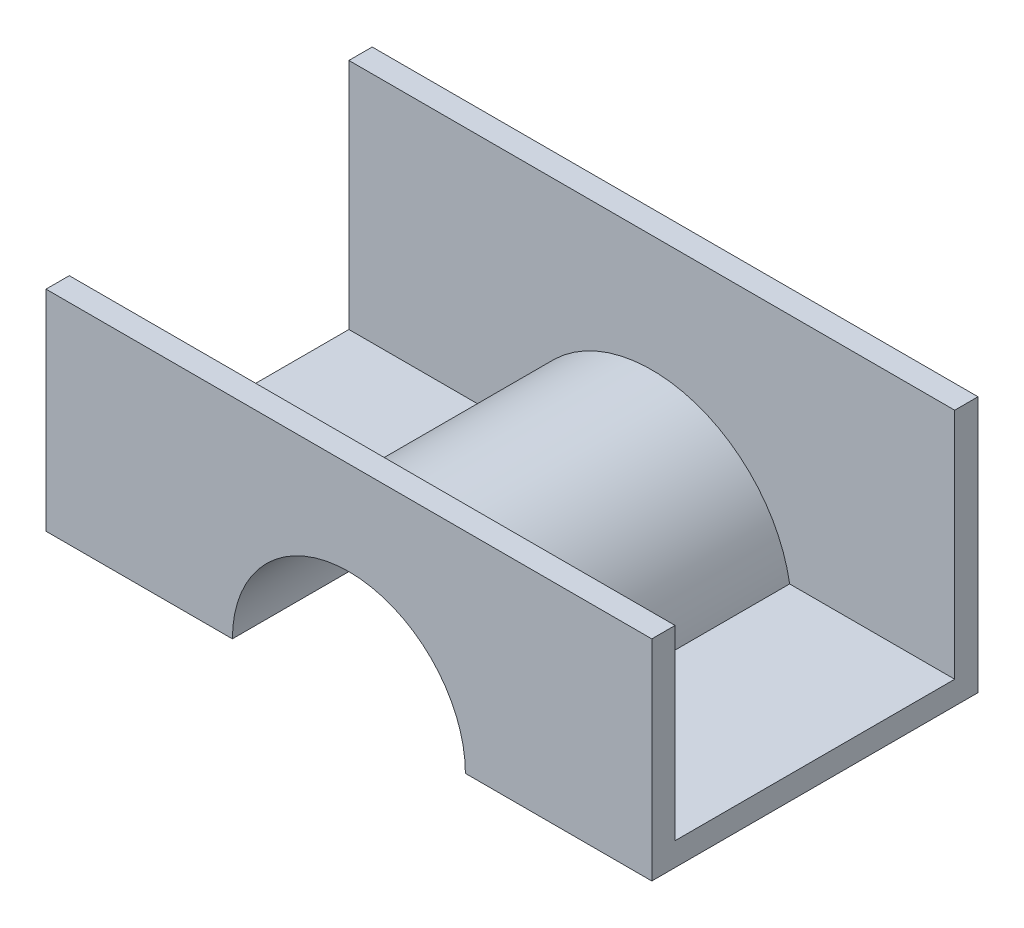
ISO-10303-21;
HEADER;
FILE_DESCRIPTION(('STEP AP214'),'2;1');
FILE_NAME('part.step','',(''),(''),'','','');
FILE_SCHEMA(('AUTOMOTIVE_DESIGN { 1 0 10303 214 1 1 1 1 }'));
ENDSEC;
DATA;
#1=APPLICATION_CONTEXT('core data for automotive mechanical design processes');
#2=APPLICATION_PROTOCOL_DEFINITION('international standard','automotive_design',2000,#1);
#3=PRODUCT_CONTEXT('',#1,'mechanical');
#4=PRODUCT('Part','Part','',(#3));
#5=PRODUCT_RELATED_PRODUCT_CATEGORY('part','',(#4));
#6=PRODUCT_DEFINITION_FORMATION('','',#4);
#7=PRODUCT_DEFINITION_CONTEXT('part definition',#1,'design');
#8=PRODUCT_DEFINITION('design','',#6,#7);
#9=PRODUCT_DEFINITION_SHAPE('','',#8);
#10=(LENGTH_UNIT() NAMED_UNIT(*) SI_UNIT(.MILLI.,.METRE.));
#11=(NAMED_UNIT(*) PLANE_ANGLE_UNIT() SI_UNIT($,.RADIAN.));
#12=(NAMED_UNIT(*) SI_UNIT($,.STERADIAN.) SOLID_ANGLE_UNIT());
#13=UNCERTAINTY_MEASURE_WITH_UNIT(LENGTH_MEASURE(1.E-05),#10,'distance_accuracy_value','');
#14=(GEOMETRIC_REPRESENTATION_CONTEXT(3) GLOBAL_UNCERTAINTY_ASSIGNED_CONTEXT((#13)) GLOBAL_UNIT_ASSIGNED_CONTEXT((#10,
#11,#12)) REPRESENTATION_CONTEXT('',''));
#15=CARTESIAN_POINT('',(0.,0.,0.));
#16=DIRECTION('',(0.,0.,1.));
#17=DIRECTION('',(1.,0.,0.));
#18=AXIS2_PLACEMENT_3D('',#15,#16,#17);
#19=CARTESIAN_POINT('',(-0.00667937524967909,-1.70902601954589,0.0059580262507078));
#20=DIRECTION('',(0.,0.,1.));
#21=DIRECTION('',(1.,0.,0.));
#22=AXIS2_PLACEMENT_3D('',#19,#20,#21);
#23=PLANE('',#22);
#24=DIRECTION('',(1.,0.,0.));
#25=VECTOR('',#24,1.);
#26=CARTESIAN_POINT('',(-0.00667937524967909,-1.80305198756978,0.0059580262507078));
#27=LINE('',#26,#25);
#28=CARTESIAN_POINT('',(-0.412929375249647,-1.80305198756978,0.0059580262507078));
#29=VERTEX_POINT('',#28);
#30=CARTESIAN_POINT('',(-0.16292937524967,-1.80305198756976,0.00595802625068876));
#31=VERTEX_POINT('',#30);
#32=EDGE_CURVE('E11',#29,#31,#27,.T.);
#33=ORIENTED_EDGE('',*,*,#32,.F.);
#34=DIRECTION('',(0.,-1.,0.));
#35=VECTOR('',#34,1.);
#36=CARTESIAN_POINT('',(-0.412929375249643,-1.70902601954589,0.0059580262507078));
#37=LINE('',#36,#35);
#38=CARTESIAN_POINT('',(-0.412929375249658,-1.45930198756974,0.0059580262507078));
#39=VERTEX_POINT('',#38);
#40=EDGE_CURVE('E24',#39,#29,#37,.T.);
#41=ORIENTED_EDGE('',*,*,#40,.F.);
#42=DIRECTION('',(-1.,0.,0.));
#43=VECTOR('',#42,1.);
#44=CARTESIAN_POINT('',(-0.00667937524967909,-1.4593019875697,0.0059580262507078));
#45=LINE('',#44,#43);
#46=CARTESIAN_POINT('',(0.399570624750305,-1.45930198756971,0.0059580262507078));
#47=VERTEX_POINT('',#46);
#48=EDGE_CURVE('E195',#47,#39,#45,.T.);
#49=ORIENTED_EDGE('',*,*,#48,.F.);
#50=DIRECTION('',(0.,1.,0.));
#51=VECTOR('',#50,1.);
#52=CARTESIAN_POINT('',(0.399570624750316,-1.70902601954589,0.0059580262507078));
#53=LINE('',#52,#51);
#54=CARTESIAN_POINT('',(0.399570624750316,-1.80305198756971,0.0059580262507078));
#55=VERTEX_POINT('',#54);
#56=EDGE_CURVE('E192',#55,#47,#53,.T.);
#57=ORIENTED_EDGE('',*,*,#56,.F.);
#58=DIRECTION('',(1.,0.,0.));
#59=VECTOR('',#58,1.);
#60=CARTESIAN_POINT('',(-0.00667937524967909,-1.80305198756972,0.0059580262507078));
#61=LINE('',#60,#59);
#62=CARTESIAN_POINT('',(0.14957062475033,-1.80305198756975,0.00595802625070778));
#63=VERTEX_POINT('',#62);
#64=EDGE_CURVE('E189',#63,#55,#61,.T.);
#65=ORIENTED_EDGE('',*,*,#64,.F.);
#66=CARTESIAN_POINT('',(-0.0066793752496696,-1.80305198756977,0.00595802625069509));
#67=DIRECTION('',(1.62409768173737E-13,0.,-1.));
#68=DIRECTION('',(1.,-1.65145674912992E-13,1.62409768173737E-13));
#69=AXIS2_PLACEMENT_3D('',#66,#67,#68);
#70=CIRCLE('',#69,0.15625);
#71=EDGE_CURVE('E186',#31,#63,#70,.T.);
#72=ORIENTED_EDGE('',*,*,#71,.F.);
#73=EDGE_LOOP('',(#33,#41,#49,#57,#65,#72));
#74=FACE_BOUND('',#73,.T.);
#75=ADVANCED_FACE('F17',(#74),#23,.F.);
#76=CARTESIAN_POINT('',(-0.0066793752496696,-1.80305198756977,0.00595802625073314));
#77=DIRECTION('',(-1.62409768173737E-13,0.,1.));
#78=DIRECTION('',(1.,0.,1.62409768173737E-13));
#79=AXIS2_PLACEMENT_3D('',#76,#77,#78);
#80=CYLINDRICAL_SURFACE('',#79,0.15625);
#81=DIRECTION('',(1.62409768173737E-13,0.,-1.));
#82=VECTOR('',#81,1.);
#83=CARTESIAN_POINT('',(0.14957062475033,-1.80305198756977,0.00595802625075852));
#84=LINE('',#83,#82);
#85=CARTESIAN_POINT('',(0.149570624750259,-1.80305198756975,0.443458026250721));
#86=VERTEX_POINT('',#85);
#87=EDGE_CURVE('E183',#86,#63,#84,.T.);
#88=ORIENTED_EDGE('',*,*,#87,.F.);
#89=CARTESIAN_POINT('',(-0.00667937524974066,-1.80305198756977,0.443458026250708));
#90=DIRECTION('',(1.62409768173737E-13,0.,-1.));
#91=DIRECTION('',(1.,-1.63757896132211E-13,1.62409768173737E-13));
#92=AXIS2_PLACEMENT_3D('',#89,#90,#91);
#93=CIRCLE('',#92,0.15625);
#94=CARTESIAN_POINT('',(-0.162929375249741,-1.80305198756975,0.443458026250695));
#95=VERTEX_POINT('',#94);
#96=EDGE_CURVE('E181',#95,#86,#93,.T.);
#97=ORIENTED_EDGE('',*,*,#96,.F.);
#98=DIRECTION('',(-1.62409768173737E-13,0.,1.));
#99=VECTOR('',#98,1.);
#100=CARTESIAN_POINT('',(-0.16292937524967,-1.80305198756975,0.00595802625070776));
#101=LINE('',#100,#99);
#102=EDGE_CURVE('E179',#31,#95,#101,.T.);
#103=ORIENTED_EDGE('',*,*,#102,.F.);
#104=ORIENTED_EDGE('',*,*,#71,.T.);
#105=EDGE_LOOP('',(#88,#97,#103,#104));
#106=FACE_BOUND('',#105,.T.);
#107=ADVANCED_FACE('F235',(#106),#80,.F.);
#108=CARTESIAN_POINT('',(-0.16292937524967,-1.80305198756975,0.0059580262507078));
#109=DIRECTION('',(1.01196828694583E-13,-1.,0.));
#110=DIRECTION('',(1.,1.01196828694583E-13,0.));
#111=AXIS2_PLACEMENT_3D('',#108,#109,#110);
#112=PLANE('',#111);
#113=DIRECTION('',(-1.,-1.01196828694583E-13,0.));
#114=VECTOR('',#113,1.);
#115=CARTESIAN_POINT('',(-0.16292937524967,-1.80305198756975,0.443458026250682));
#116=LINE('',#115,#114);
#117=CARTESIAN_POINT('',(-0.412929375249656,-1.80305198756978,0.443458026250691));
#118=VERTEX_POINT('',#117);
#119=EDGE_CURVE('E177',#95,#118,#116,.T.);
#120=ORIENTED_EDGE('',*,*,#119,.T.);
#121=DIRECTION('',(0.,0.,-1.));
#122=VECTOR('',#121,1.);
#123=CARTESIAN_POINT('',(-0.412929375249656,-1.80305198756978,0.0059580262507078));
#124=LINE('',#123,#122);
#125=EDGE_CURVE('E175',#118,#29,#124,.T.);
#126=ORIENTED_EDGE('',*,*,#125,.T.);
#127=ORIENTED_EDGE('',*,*,#32,.T.);
#128=ORIENTED_EDGE('',*,*,#102,.T.);
#129=EDGE_LOOP('',(#120,#126,#127,#128));
#130=FACE_BOUND('',#129,.T.);
#131=ADVANCED_FACE('F201',(#130),#112,.T.);
#132=CARTESIAN_POINT('',(-0.41292937524969,-1.45930198756977,0.412208026250708));
#133=DIRECTION('',(-1.,-1.01196828694583E-13,0.));
#134=DIRECTION('',(1.01196828694583E-13,-1.,0.));
#135=AXIS2_PLACEMENT_3D('',#132,#133,#134);
#136=PLANE('',#135);
#137=DIRECTION('',(0.,0.,-1.));
#138=VECTOR('',#137,1.);
#139=CARTESIAN_POINT('',(-0.41292937524969,-1.45930198756981,0.412208026250708));
#140=LINE('',#139,#138);
#141=CARTESIAN_POINT('',(-0.41292937524969,-1.45930198756981,0.0372080262507079));
#142=VERTEX_POINT('',#141);
#143=EDGE_CURVE('E172',#142,#39,#140,.T.);
#144=ORIENTED_EDGE('',*,*,#143,.T.);
#145=ORIENTED_EDGE('',*,*,#40,.T.);
#146=ORIENTED_EDGE('',*,*,#125,.F.);
#147=DIRECTION('',(-1.01196828694583E-13,1.,0.));
#148=VECTOR('',#147,1.);
#149=CARTESIAN_POINT('',(-0.41292937524969,-1.45930198756977,0.443458026250708));
#150=LINE('',#149,#148);
#151=CARTESIAN_POINT('',(-0.412929375249684,-1.52180198756976,0.443458026250708));
#152=VERTEX_POINT('',#151);
#153=EDGE_CURVE('E170',#118,#152,#150,.T.);
#154=ORIENTED_EDGE('',*,*,#153,.T.);
#155=DIRECTION('',(0.,0.,-1.));
#156=VECTOR('',#155,1.);
#157=CARTESIAN_POINT('',(-0.412929375249684,-1.52180198756979,0.412208026250708));
#158=LINE('',#157,#156);
#159=CARTESIAN_POINT('',(-0.412929375249684,-1.52180198756979,0.412208026250708));
#160=VERTEX_POINT('',#159);
#161=EDGE_CURVE('E168',#152,#160,#158,.T.);
#162=ORIENTED_EDGE('',*,*,#161,.T.);
#163=DIRECTION('',(1.01196828694583E-13,-1.,0.));
#164=VECTOR('',#163,1.);
#165=CARTESIAN_POINT('',(-0.41292937524969,-1.45930198756977,0.412208026250708));
#166=LINE('',#165,#164);
#167=CARTESIAN_POINT('',(-0.412929375249659,-1.77180198756977,0.412208026250708));
#168=VERTEX_POINT('',#167);
#169=EDGE_CURVE('E166',#160,#168,#166,.T.);
#170=ORIENTED_EDGE('',*,*,#169,.T.);
#171=DIRECTION('',(0.,0.,-1.));
#172=VECTOR('',#171,1.);
#173=CARTESIAN_POINT('',(-0.412929375249659,-1.77180198756977,0.412208026250708));
#174=LINE('',#173,#172);
#175=CARTESIAN_POINT('',(-0.412929375249669,-1.77180198756977,0.0372080262507079));
#176=VERTEX_POINT('',#175);
#177=EDGE_CURVE('E164',#168,#176,#174,.T.);
#178=ORIENTED_EDGE('',*,*,#177,.T.);
#179=DIRECTION('',(-1.01196828694583E-13,1.,0.));
#180=VECTOR('',#179,1.);
#181=CARTESIAN_POINT('',(-0.41292937524969,-1.45930198756977,0.0372080262507079));
#182=LINE('',#181,#180);
#183=EDGE_CURVE('E161',#176,#142,#182,.T.);
#184=ORIENTED_EDGE('',*,*,#183,.T.);
#185=EDGE_LOOP('',(#144,#145,#146,#154,#162,#170,#178,#184));
#186=FACE_BOUND('',#185,.T.);
#187=ADVANCED_FACE('F199',(#186),#136,.T.);
#188=CARTESIAN_POINT('',(-0.412929375249619,-1.45930198756981,0.00595802625070787));
#189=DIRECTION('',(-1.01196828694583E-13,1.,0.));
#190=DIRECTION('',(-1.,-1.01196828694583E-13,0.));
#191=AXIS2_PLACEMENT_3D('',#188,#189,#190);
#192=PLANE('',#191);
#193=DIRECTION('',(1.,1.01196828694583E-13,0.));
#194=VECTOR('',#193,1.);
#195=CARTESIAN_POINT('',(-0.412929375249619,-1.45930198756981,0.037208026250708));
#196=LINE('',#195,#194);
#197=CARTESIAN_POINT('',(0.399570624750281,-1.45930198756973,0.037208026250708));
#198=VERTEX_POINT('',#197);
#199=EDGE_CURVE('E159',#142,#198,#196,.T.);
#200=ORIENTED_EDGE('',*,*,#199,.T.);
#201=DIRECTION('',(0.,0.,-1.));
#202=VECTOR('',#201,1.);
#203=CARTESIAN_POINT('',(0.399570624750281,-1.45930198756973,0.00595802625070787));
#204=LINE('',#203,#202);
#205=EDGE_CURVE('E156',#198,#47,#204,.T.);
#206=ORIENTED_EDGE('',*,*,#205,.T.);
#207=ORIENTED_EDGE('',*,*,#48,.T.);
#208=ORIENTED_EDGE('',*,*,#143,.F.);
#209=EDGE_LOOP('',(#200,#206,#207,#208));
#210=FACE_BOUND('',#209,.T.);
#211=ADVANCED_FACE('F228',(#210),#192,.T.);
#212=CARTESIAN_POINT('',(0.399570624750281,-1.45930198756969,0.443458026250708));
#213=DIRECTION('',(1.,1.01196828694583E-13,0.));
#214=DIRECTION('',(-1.01196828694583E-13,1.,0.));
#215=AXIS2_PLACEMENT_3D('',#212,#213,#214);
#216=PLANE('',#215);
#217=ORIENTED_EDGE('',*,*,#205,.F.);
#218=DIRECTION('',(1.01196828694583E-13,-1.,0.));
#219=VECTOR('',#218,1.);
#220=CARTESIAN_POINT('',(0.399570624750281,-1.45930198756969,0.0372080262507079));
#221=LINE('',#220,#219);
#222=CARTESIAN_POINT('',(0.399570624750313,-1.7718019875697,0.0372080262507079));
#223=VERTEX_POINT('',#222);
#224=EDGE_CURVE('E154',#198,#223,#221,.T.);
#225=ORIENTED_EDGE('',*,*,#224,.T.);
#226=DIRECTION('',(0.,0.,1.));
#227=VECTOR('',#226,1.);
#228=CARTESIAN_POINT('',(0.399570624750313,-1.77180198756969,0.443458026250708));
#229=LINE('',#228,#227);
#230=CARTESIAN_POINT('',(0.399570624750305,-1.77180198756969,0.412208026250708));
#231=VERTEX_POINT('',#230);
#232=EDGE_CURVE('E152',#223,#231,#229,.T.);
#233=ORIENTED_EDGE('',*,*,#232,.T.);
#234=DIRECTION('',(-1.01196828694583E-13,1.,0.));
#235=VECTOR('',#234,1.);
#236=CARTESIAN_POINT('',(0.399570624750281,-1.45930198756969,0.412208026250708));
#237=LINE('',#236,#235);
#238=CARTESIAN_POINT('',(0.399570624750288,-1.52180198756973,0.412208026250708));
#239=VERTEX_POINT('',#238);
#240=EDGE_CURVE('E108',#231,#239,#237,.T.);
#241=ORIENTED_EDGE('',*,*,#240,.T.);
#242=DIRECTION('',(0.,0.,1.));
#243=VECTOR('',#242,1.);
#244=CARTESIAN_POINT('',(0.399570624750288,-1.52180198756971,0.443458026250708));
#245=LINE('',#244,#243);
#246=CARTESIAN_POINT('',(0.399570624750297,-1.52180198756971,0.443458026250708));
#247=VERTEX_POINT('',#246);
#248=EDGE_CURVE('E149',#239,#247,#245,.T.);
#249=ORIENTED_EDGE('',*,*,#248,.T.);
#250=DIRECTION('',(1.01196828694583E-13,-1.,0.));
#251=VECTOR('',#250,1.);
#252=CARTESIAN_POINT('',(0.399570624750281,-1.45930198756969,0.443458026250708));
#253=LINE('',#252,#251);
#254=CARTESIAN_POINT('',(0.399570624750316,-1.8030519875697,0.443458026250708));
#255=VERTEX_POINT('',#254);
#256=EDGE_CURVE('E147',#247,#255,#253,.T.);
#257=ORIENTED_EDGE('',*,*,#256,.T.);
#258=DIRECTION('',(0.,0.,-1.));
#259=VECTOR('',#258,1.);
#260=CARTESIAN_POINT('',(0.399570624750316,-1.8030519875697,0.443458026250708));
#261=LINE('',#260,#259);
#262=EDGE_CURVE('E144',#255,#55,#261,.T.);
#263=ORIENTED_EDGE('',*,*,#262,.T.);
#264=ORIENTED_EDGE('',*,*,#56,.T.);
#265=EDGE_LOOP('',(#217,#225,#233,#241,#249,#257,#263,#264));
#266=FACE_BOUND('',#265,.T.);
#267=ADVANCED_FACE('F230',(#266),#216,.T.);
#268=CARTESIAN_POINT('',(0.180820624750302,-1.80305198756972,0.0059580262507078));
#269=DIRECTION('',(1.01196828694583E-13,-1.,0.));
#270=DIRECTION('',(1.,1.01196828694583E-13,0.));
#271=AXIS2_PLACEMENT_3D('',#268,#269,#270);
#272=PLANE('',#271);
#273=DIRECTION('',(-1.,-1.01196828694583E-13,0.));
#274=VECTOR('',#273,1.);
#275=CARTESIAN_POINT('',(0.180820624750302,-1.80305198756972,0.443458026250708));
#276=LINE('',#275,#274);
#277=EDGE_CURVE('E141',#255,#86,#276,.T.);
#278=ORIENTED_EDGE('',*,*,#277,.T.);
#279=ORIENTED_EDGE('',*,*,#87,.T.);
#280=ORIENTED_EDGE('',*,*,#64,.T.);
#281=ORIENTED_EDGE('',*,*,#262,.F.);
#282=EDGE_LOOP('',(#278,#279,#280,#281));
#283=FACE_BOUND('',#282,.T.);
#284=ADVANCED_FACE('F233',(#283),#272,.T.);
#285=CARTESIAN_POINT('',(-0.41292937524969,-1.45930198756977,0.443458026250708));
#286=DIRECTION('',(0.,0.,1.));
#287=DIRECTION('',(1.,0.,0.));
#288=AXIS2_PLACEMENT_3D('',#285,#286,#287);
#289=PLANE('',#288);
#290=ORIENTED_EDGE('',*,*,#119,.F.);
#291=ORIENTED_EDGE('',*,*,#96,.T.);
#292=ORIENTED_EDGE('',*,*,#277,.F.);
#293=ORIENTED_EDGE('',*,*,#256,.F.);
#294=DIRECTION('',(-1.,0.,0.));
#295=VECTOR('',#294,1.);
#296=CARTESIAN_POINT('',(-0.41292937524969,-1.52180198756971,0.443458026250708));
#297=LINE('',#296,#295);
#298=EDGE_CURVE('E138',#247,#152,#297,.T.);
#299=ORIENTED_EDGE('',*,*,#298,.T.);
#300=ORIENTED_EDGE('',*,*,#153,.F.);
#301=EDGE_LOOP('',(#290,#291,#292,#293,#299,#300));
#302=FACE_BOUND('',#301,.T.);
#303=ADVANCED_FACE('F206',(#302),#289,.T.);
#304=CARTESIAN_POINT('',(-0.00667937524968858,-1.61555198756977,0.0372080262507079));
#305=DIRECTION('',(0.,0.,1.));
#306=DIRECTION('',(1.,0.,0.));
#307=AXIS2_PLACEMENT_3D('',#304,#305,#306);
#308=PLANE('',#307);
#309=ORIENTED_EDGE('',*,*,#224,.F.);
#310=ORIENTED_EDGE('',*,*,#199,.F.);
#311=ORIENTED_EDGE('',*,*,#183,.F.);
#312=DIRECTION('',(1.,0.,0.));
#313=VECTOR('',#312,1.);
#314=CARTESIAN_POINT('',(-0.00667937524968858,-1.77180198756977,0.0372080262507079));
#315=LINE('',#314,#313);
#316=CARTESIAN_POINT('',(-0.191556868471649,-1.77180198756976,0.0372080262506704));
#317=VERTEX_POINT('',#316);
#318=EDGE_CURVE('E136',#176,#317,#315,.T.);
#319=ORIENTED_EDGE('',*,*,#318,.T.);
#320=CARTESIAN_POINT('',(-0.00667937524974583,-1.8030519875697,0.0372080262506629));
#321=DIRECTION('',(1.62409768173737E-13,0.,-1.));
#322=DIRECTION('',(1.,0.,1.62409768173737E-13));
#323=AXIS2_PLACEMENT_3D('',#320,#321,#322);
#324=CIRCLE('',#323,0.187500000000043);
#325=CARTESIAN_POINT('',(0.178198117972179,-1.77180198756971,0.0372080262506854));
#326=VERTEX_POINT('',#325);
#327=EDGE_CURVE('E134',#317,#326,#324,.T.);
#328=ORIENTED_EDGE('',*,*,#327,.T.);
#329=DIRECTION('',(1.,0.,0.));
#330=VECTOR('',#329,1.);
#331=CARTESIAN_POINT('',(-0.00667937524968858,-1.77180198756971,0.0372080262507079));
#332=LINE('',#331,#330);
#333=EDGE_CURVE('E127',#326,#223,#332,.T.);
#334=ORIENTED_EDGE('',*,*,#333,.T.);
#335=EDGE_LOOP('',(#309,#310,#311,#319,#328,#334));
#336=FACE_BOUND('',#335,.T.);
#337=ADVANCED_FACE('F224',(#336),#308,.T.);
#338=CARTESIAN_POINT('',(0.399570624750313,-1.77180198756969,0.412208026250708));
#339=DIRECTION('',(-1.01196828694583E-13,1.,0.));
#340=DIRECTION('',(-1.,-1.01196828694583E-13,0.));
#341=AXIS2_PLACEMENT_3D('',#338,#339,#340);
#342=PLANE('',#341);
#343=DIRECTION('',(0.,0.,-1.));
#344=VECTOR('',#343,1.);
#345=CARTESIAN_POINT('',(-0.191556868471649,-1.77180198756975,0.412208026250708));
#346=LINE('',#345,#344);
#347=CARTESIAN_POINT('',(-0.191556868471685,-1.77180198756975,0.41220802625073));
#348=VERTEX_POINT('',#347);
#349=EDGE_CURVE('E120',#348,#317,#346,.T.);
#350=ORIENTED_EDGE('',*,*,#349,.T.);
#351=ORIENTED_EDGE('',*,*,#318,.F.);
#352=ORIENTED_EDGE('',*,*,#177,.F.);
#353=DIRECTION('',(1.,1.01196828694583E-13,0.));
#354=VECTOR('',#353,1.);
#355=CARTESIAN_POINT('',(0.399570624750313,-1.77180198756969,0.412208026250708));
#356=LINE('',#355,#354);
#357=EDGE_CURVE('E112',#168,#348,#356,.T.);
#358=ORIENTED_EDGE('',*,*,#357,.T.);
#359=EDGE_LOOP('',(#350,#351,#352,#358));
#360=FACE_BOUND('',#359,.T.);
#361=ADVANCED_FACE('F221',(#360),#342,.T.);
#362=CARTESIAN_POINT('',(0.399570624750281,-1.45930198756969,0.412208026250708));
#363=DIRECTION('',(0.,0.,-1.));
#364=DIRECTION('',(-1.,0.,0.));
#365=AXIS2_PLACEMENT_3D('',#362,#363,#364);
#366=PLANE('',#365);
#367=DIRECTION('',(-1.,0.,0.));
#368=VECTOR('',#367,1.);
#369=CARTESIAN_POINT('',(0.399570624750281,-1.77180198756969,0.412208026250708));
#370=LINE('',#369,#368);
#371=CARTESIAN_POINT('',(0.178198117972147,-1.7718019875697,0.41220802625073));
#372=VERTEX_POINT('',#371);
#373=EDGE_CURVE('E102',#231,#372,#370,.T.);
#374=ORIENTED_EDGE('',*,*,#373,.T.);
#375=CARTESIAN_POINT('',(-0.00667937524980673,-1.8030519875697,0.412208026250753));
#376=DIRECTION('',(-1.62409768173737E-13,0.,1.));
#377=DIRECTION('',(1.,0.,1.62409768173737E-13));
#378=AXIS2_PLACEMENT_3D('',#375,#376,#377);
#379=CIRCLE('',#378,0.187500000000043);
#380=EDGE_CURVE('E106',#372,#348,#379,.T.);
#381=ORIENTED_EDGE('',*,*,#380,.T.);
#382=ORIENTED_EDGE('',*,*,#357,.F.);
#383=ORIENTED_EDGE('',*,*,#169,.F.);
#384=DIRECTION('',(1.,0.,0.));
#385=VECTOR('',#384,1.);
#386=CARTESIAN_POINT('',(0.399570624750281,-1.52180198756979,0.412208026250708));
#387=LINE('',#386,#385);
#388=EDGE_CURVE('E122',#160,#239,#387,.T.);
#389=ORIENTED_EDGE('',*,*,#388,.T.);
#390=ORIENTED_EDGE('',*,*,#240,.F.);
#391=EDGE_LOOP('',(#374,#381,#382,#383,#389,#390));
#392=FACE_BOUND('',#391,.T.);
#393=ADVANCED_FACE('F104',(#392),#366,.T.);
#394=CARTESIAN_POINT('',(-0.00667937524976921,-1.52180198756975,0.427833026250708));
#395=DIRECTION('',(-1.01196828694126E-13,1.,0.));
#396=DIRECTION('',(-1.,-1.01196828694126E-13,0.));
#397=AXIS2_PLACEMENT_3D('',#394,#395,#396);
#398=PLANE('',#397);
#399=ORIENTED_EDGE('',*,*,#388,.F.);
#400=ORIENTED_EDGE('',*,*,#161,.F.);
#401=ORIENTED_EDGE('',*,*,#298,.F.);
#402=ORIENTED_EDGE('',*,*,#248,.F.);
#403=EDGE_LOOP('',(#399,#400,#401,#402));
#404=FACE_BOUND('',#403,.T.);
#405=ADVANCED_FACE('F215',(#404),#398,.T.);
#406=CARTESIAN_POINT('',(0.399570624750313,-1.77180198756969,0.412208026250708));
#407=DIRECTION('',(-1.01196828694583E-13,1.,0.));
#408=DIRECTION('',(-1.,-1.01196828694583E-13,0.));
#409=AXIS2_PLACEMENT_3D('',#406,#407,#408);
#410=PLANE('',#409);
#411=DIRECTION('',(0.,0.,1.));
#412=VECTOR('',#411,1.);
#413=CARTESIAN_POINT('',(0.178198117972197,-1.77180198756971,0.412208026250708));
#414=LINE('',#413,#412);
#415=EDGE_CURVE('E118',#326,#372,#414,.T.);
#416=ORIENTED_EDGE('',*,*,#415,.T.);
#417=ORIENTED_EDGE('',*,*,#373,.F.);
#418=ORIENTED_EDGE('',*,*,#232,.F.);
#419=ORIENTED_EDGE('',*,*,#333,.F.);
#420=EDGE_LOOP('',(#416,#417,#418,#419));
#421=FACE_BOUND('',#420,.T.);
#422=ADVANCED_FACE('F125',(#421),#410,.T.);
#423=CARTESIAN_POINT('',(-0.00667937524974075,-1.8030519875697,0.0059580262507078));
#424=DIRECTION('',(-1.62409768173737E-13,0.,1.));
#425=DIRECTION('',(1.,0.,1.62409768173737E-13));
#426=AXIS2_PLACEMENT_3D('',#423,#424,#425);
#427=CYLINDRICAL_SURFACE('',#426,0.187500000000043);
#428=ORIENTED_EDGE('',*,*,#380,.F.);
#429=ORIENTED_EDGE('',*,*,#415,.F.);
#430=ORIENTED_EDGE('',*,*,#327,.F.);
#431=ORIENTED_EDGE('',*,*,#349,.F.);
#432=EDGE_LOOP('',(#428,#429,#430,#431));
#433=FACE_BOUND('',#432,.T.);
#434=ADVANCED_FACE('F116',(#433),#427,.T.);
#435=CLOSED_SHELL('',(#75,#107,#131,#187,#211,#267,#284,#303,#337,#361,#393,#405,#422,#434));
#436=MANIFOLD_SOLID_BREP('B1',#435);
#437=ADVANCED_BREP_SHAPE_REPRESENTATION('',(#18,#436),#14);
#438=SHAPE_DEFINITION_REPRESENTATION(#9,#437);
ENDSEC;
END-ISO-10303-21;
